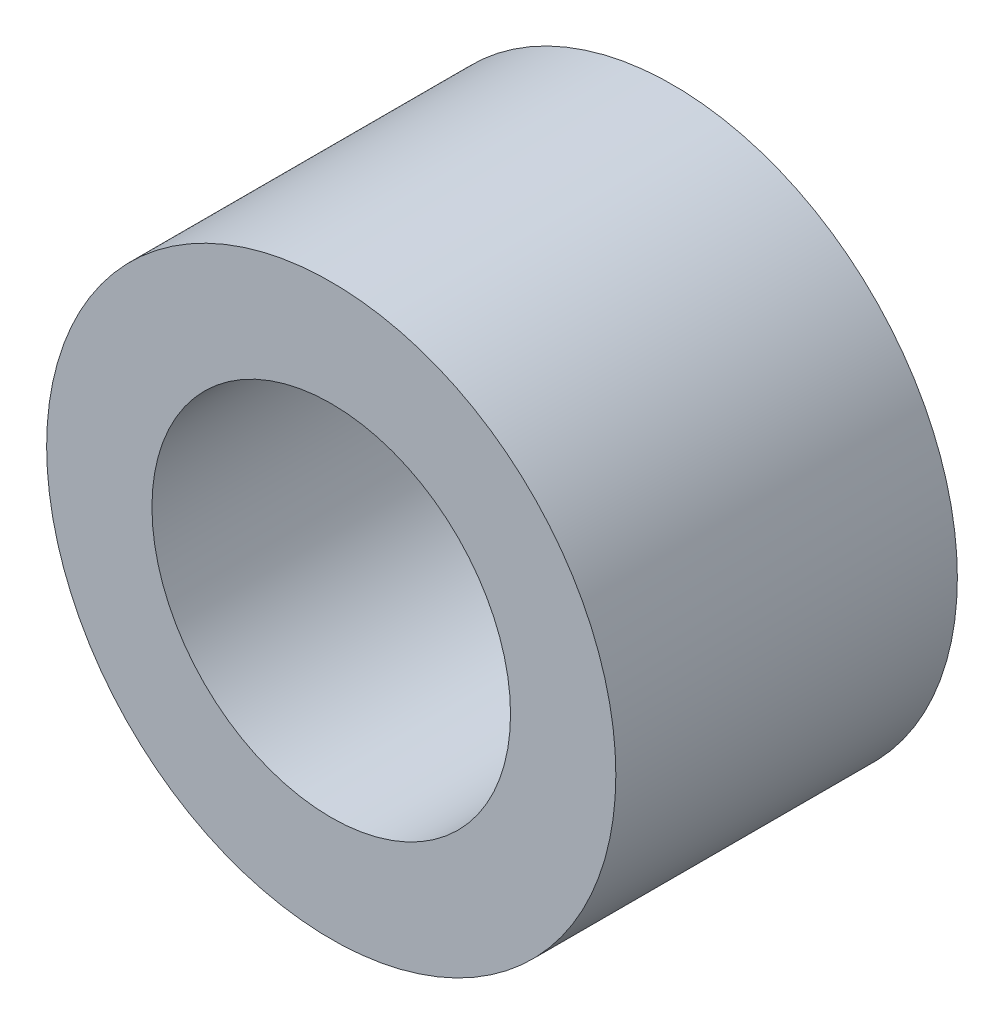
ISO-10303-21;
HEADER;
FILE_DESCRIPTION(('STEP AP214'),'2;1');
FILE_NAME('part.step','',(''),(''),'','','');
FILE_SCHEMA(('AUTOMOTIVE_DESIGN { 1 0 10303 214 1 1 1 1 }'));
ENDSEC;
DATA;
#1=APPLICATION_CONTEXT('core data for automotive mechanical design processes');
#2=APPLICATION_PROTOCOL_DEFINITION('international standard','automotive_design',2000,#1);
#3=PRODUCT_CONTEXT('',#1,'mechanical');
#4=PRODUCT('Part','Part','',(#3));
#5=PRODUCT_RELATED_PRODUCT_CATEGORY('part','',(#4));
#6=PRODUCT_DEFINITION_FORMATION('','',#4);
#7=PRODUCT_DEFINITION_CONTEXT('part definition',#1,'design');
#8=PRODUCT_DEFINITION('design','',#6,#7);
#9=PRODUCT_DEFINITION_SHAPE('','',#8);
#10=(LENGTH_UNIT() NAMED_UNIT(*) SI_UNIT(.MILLI.,.METRE.));
#11=(NAMED_UNIT(*) PLANE_ANGLE_UNIT() SI_UNIT($,.RADIAN.));
#12=(NAMED_UNIT(*) SI_UNIT($,.STERADIAN.) SOLID_ANGLE_UNIT());
#13=UNCERTAINTY_MEASURE_WITH_UNIT(LENGTH_MEASURE(1.E-05),#10,'distance_accuracy_value','');
#14=(GEOMETRIC_REPRESENTATION_CONTEXT(3) GLOBAL_UNCERTAINTY_ASSIGNED_CONTEXT((#13)) GLOBAL_UNIT_ASSIGNED_CONTEXT((#10,
#11,#12)) REPRESENTATION_CONTEXT('',''));
#15=CARTESIAN_POINT('',(0.,0.,0.));
#16=DIRECTION('',(0.,0.,1.));
#17=DIRECTION('',(1.,0.,0.));
#18=AXIS2_PLACEMENT_3D('',#15,#16,#17);
#19=CARTESIAN_POINT('',(0.,0.,3.));
#20=DIRECTION('',(0.,0.,1.));
#21=DIRECTION('',(1.,0.,0.));
#22=AXIS2_PLACEMENT_3D('',#19,#20,#21);
#23=PLANE('',#22);
#24=CARTESIAN_POINT('',(0.,0.,3.));
#25=DIRECTION('',(0.,0.,1.));
#26=DIRECTION('',(1.,0.,0.));
#27=AXIS2_PLACEMENT_3D('',#24,#25,#26);
#28=CIRCLE('',#27,5.);
#29=CARTESIAN_POINT('',(5.,0.,3.));
#30=VERTEX_POINT('',#29);
#31=EDGE_CURVE('E10',#30,#30,#28,.T.);
#32=ORIENTED_EDGE('',*,*,#31,.T.);
#33=EDGE_LOOP('',(#32));
#34=FACE_BOUND('',#33,.T.);
#35=CARTESIAN_POINT('',(0.,0.,3.));
#36=DIRECTION('',(0.,0.,1.));
#37=DIRECTION('',(1.,0.,0.));
#38=AXIS2_PLACEMENT_3D('',#35,#36,#37);
#39=CIRCLE('',#38,3.15);
#40=CARTESIAN_POINT('',(3.15,0.,3.));
#41=VERTEX_POINT('',#40);
#42=EDGE_CURVE('E50',#41,#41,#39,.T.);
#43=ORIENTED_EDGE('',*,*,#42,.F.);
#44=EDGE_LOOP('',(#43));
#45=FACE_BOUND('',#44,.T.);
#46=ADVANCED_FACE('F37',(#34,#45),#23,.T.);
#47=CARTESIAN_POINT('',(0.,0.,-3.));
#48=DIRECTION('',(0.,0.,1.));
#49=DIRECTION('',(1.,0.,0.));
#50=AXIS2_PLACEMENT_3D('',#47,#48,#49);
#51=PLANE('',#50);
#52=CARTESIAN_POINT('',(0.,0.,-3.));
#53=DIRECTION('',(0.,0.,1.));
#54=DIRECTION('',(1.,0.,0.));
#55=AXIS2_PLACEMENT_3D('',#52,#53,#54);
#56=CIRCLE('',#55,5.);
#57=CARTESIAN_POINT('',(5.,0.,-3.));
#58=VERTEX_POINT('',#57);
#59=EDGE_CURVE('E41',#58,#58,#56,.T.);
#60=ORIENTED_EDGE('',*,*,#59,.F.);
#61=EDGE_LOOP('',(#60));
#62=FACE_BOUND('',#61,.T.);
#63=CARTESIAN_POINT('',(0.,0.,-3.));
#64=DIRECTION('',(0.,0.,1.));
#65=DIRECTION('',(1.,0.,0.));
#66=AXIS2_PLACEMENT_3D('',#63,#64,#65);
#67=CIRCLE('',#66,3.15);
#68=CARTESIAN_POINT('',(3.15,0.,-3.));
#69=VERTEX_POINT('',#68);
#70=EDGE_CURVE('E52',#69,#69,#67,.T.);
#71=ORIENTED_EDGE('',*,*,#70,.T.);
#72=EDGE_LOOP('',(#71));
#73=FACE_BOUND('',#72,.T.);
#74=ADVANCED_FACE('F64',(#62,#73),#51,.F.);
#75=CARTESIAN_POINT('',(0.,0.,3.));
#76=DIRECTION('',(0.,0.,-1.));
#77=DIRECTION('',(-1.,0.,0.));
#78=AXIS2_PLACEMENT_3D('',#75,#76,#77);
#79=CYLINDRICAL_SURFACE('',#78,5.);
#80=ORIENTED_EDGE('',*,*,#31,.F.);
#81=EDGE_LOOP('',(#80));
#82=FACE_BOUND('',#81,.T.);
#83=ORIENTED_EDGE('',*,*,#59,.T.);
#84=EDGE_LOOP('',(#83));
#85=FACE_BOUND('',#84,.T.);
#86=ADVANCED_FACE('F39',(#82,#85),#79,.T.);
#87=CARTESIAN_POINT('',(0.,0.,3.));
#88=DIRECTION('',(0.,0.,-1.));
#89=DIRECTION('',(-1.,0.,0.));
#90=AXIS2_PLACEMENT_3D('',#87,#88,#89);
#91=CYLINDRICAL_SURFACE('',#90,3.15);
#92=ORIENTED_EDGE('',*,*,#42,.T.);
#93=EDGE_LOOP('',(#92));
#94=FACE_BOUND('',#93,.T.);
#95=ORIENTED_EDGE('',*,*,#70,.F.);
#96=EDGE_LOOP('',(#95));
#97=FACE_BOUND('',#96,.T.);
#98=ADVANCED_FACE('F60',(#94,#97),#91,.F.);
#99=CLOSED_SHELL('',(#46,#74,#86,#98));
#100=MANIFOLD_SOLID_BREP('B2',#99);
#101=ADVANCED_BREP_SHAPE_REPRESENTATION('',(#18,#100),#14);
#102=SHAPE_DEFINITION_REPRESENTATION(#9,#101);
ENDSEC;
END-ISO-10303-21;
